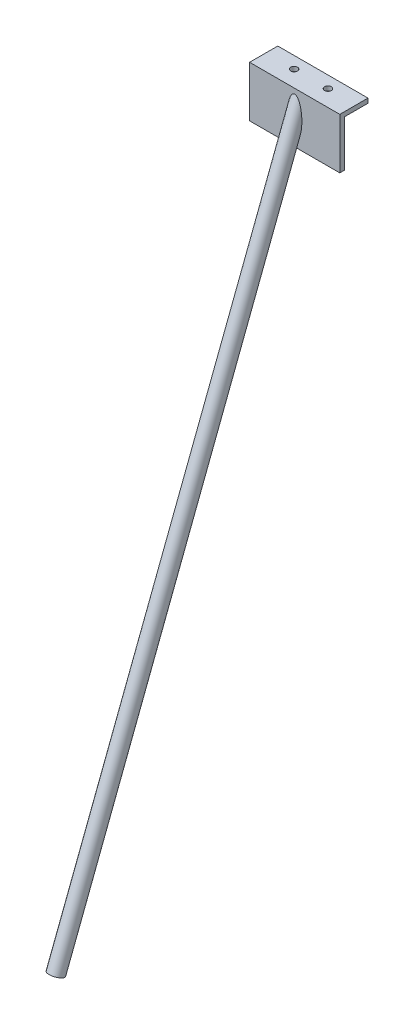
ISO-10303-21;
HEADER;
FILE_DESCRIPTION(('STEP AP214'),'2;1');
FILE_NAME('part.step','',(''),(''),'','','');
FILE_SCHEMA(('AUTOMOTIVE_DESIGN { 1 0 10303 214 1 1 1 1 }'));
ENDSEC;
DATA;
#1=APPLICATION_CONTEXT('core data for automotive mechanical design processes');
#2=APPLICATION_PROTOCOL_DEFINITION('international standard','automotive_design',2000,#1);
#3=PRODUCT_CONTEXT('',#1,'mechanical');
#4=PRODUCT('Part','Part','',(#3));
#5=PRODUCT_RELATED_PRODUCT_CATEGORY('part','',(#4));
#6=PRODUCT_DEFINITION_FORMATION('','',#4);
#7=PRODUCT_DEFINITION_CONTEXT('part definition',#1,'design');
#8=PRODUCT_DEFINITION('design','',#6,#7);
#9=PRODUCT_DEFINITION_SHAPE('','',#8);
#10=(LENGTH_UNIT() NAMED_UNIT(*) SI_UNIT(.MILLI.,.METRE.));
#11=(NAMED_UNIT(*) PLANE_ANGLE_UNIT() SI_UNIT($,.RADIAN.));
#12=(NAMED_UNIT(*) SI_UNIT($,.STERADIAN.) SOLID_ANGLE_UNIT());
#13=UNCERTAINTY_MEASURE_WITH_UNIT(LENGTH_MEASURE(1.E-05),#10,'distance_accuracy_value','');
#14=(GEOMETRIC_REPRESENTATION_CONTEXT(3) GLOBAL_UNCERTAINTY_ASSIGNED_CONTEXT((#13)) GLOBAL_UNIT_ASSIGNED_CONTEXT((#10,
#11,#12)) REPRESENTATION_CONTEXT('',''));
#15=CARTESIAN_POINT('',(0.,0.,0.));
#16=DIRECTION('',(0.,0.,1.));
#17=DIRECTION('',(1.,0.,0.));
#18=AXIS2_PLACEMENT_3D('',#15,#16,#17);
#19=CARTESIAN_POINT('',(80.,0.,0.));
#20=DIRECTION('',(0.,-1.,0.));
#21=DIRECTION('',(0.,0.,-1.));
#22=AXIS2_PLACEMENT_3D('',#19,#20,#21);
#23=PLANE('',#22);
#24=CARTESIAN_POINT('',(25.,0.,-14.5));
#25=DIRECTION('',(0.,1.,0.));
#26=DIRECTION('',(0.,0.,1.));
#27=AXIS2_PLACEMENT_3D('',#24,#25,#26);
#28=CIRCLE('',#27,3.);
#29=CARTESIAN_POINT('',(25.,0.,-11.5));
#30=VERTEX_POINT('',#29);
#31=EDGE_CURVE('E167',#30,#30,#28,.T.);
#32=ORIENTED_EDGE('',*,*,#31,.F.);
#33=EDGE_LOOP('',(#32));
#34=FACE_BOUND('',#33,.T.);
#35=DIRECTION('',(0.,0.,1.));
#36=VECTOR('',#35,1.);
#37=CARTESIAN_POINT('',(0.,0.,0.));
#38=LINE('',#37,#36);
#39=CARTESIAN_POINT('',(0.,0.,-25.));
#40=VERTEX_POINT('',#39);
#41=CARTESIAN_POINT('',(0.,0.,0.));
#42=VERTEX_POINT('',#41);
#43=EDGE_CURVE('E82',#40,#42,#38,.T.);
#44=ORIENTED_EDGE('',*,*,#43,.T.);
#45=DIRECTION('',(-1.,0.,0.));
#46=VECTOR('',#45,1.);
#47=CARTESIAN_POINT('',(80.,0.,0.));
#48=LINE('',#47,#46);
#49=CARTESIAN_POINT('',(80.,0.,0.));
#50=VERTEX_POINT('',#49);
#51=EDGE_CURVE('E118',#50,#42,#48,.T.);
#52=ORIENTED_EDGE('',*,*,#51,.F.);
#53=DIRECTION('',(0.,0.,1.));
#54=VECTOR('',#53,1.);
#55=CARTESIAN_POINT('',(80.,0.,0.));
#56=LINE('',#55,#54);
#57=CARTESIAN_POINT('',(80.,0.,-25.));
#58=VERTEX_POINT('',#57);
#59=EDGE_CURVE('E53',#58,#50,#56,.T.);
#60=ORIENTED_EDGE('',*,*,#59,.F.);
#61=DIRECTION('',(-1.,0.,0.));
#62=VECTOR('',#61,1.);
#63=CARTESIAN_POINT('',(80.,0.,-25.));
#64=LINE('',#63,#62);
#65=EDGE_CURVE('E114',#58,#40,#64,.T.);
#66=ORIENTED_EDGE('',*,*,#65,.T.);
#67=EDGE_LOOP('',(#44,#52,#60,#66));
#68=FACE_BOUND('',#67,.T.);
#69=CARTESIAN_POINT('',(55.,0.,-14.5));
#70=DIRECTION('',(0.,1.,0.));
#71=DIRECTION('',(0.,0.,1.));
#72=AXIS2_PLACEMENT_3D('',#69,#70,#71);
#73=CIRCLE('',#72,3.);
#74=CARTESIAN_POINT('',(55.,0.,-11.5));
#75=VERTEX_POINT('',#74);
#76=EDGE_CURVE('E164',#75,#75,#73,.T.);
#77=ORIENTED_EDGE('',*,*,#76,.F.);
#78=EDGE_LOOP('',(#77));
#79=FACE_BOUND('',#78,.T.);
#80=ADVANCED_FACE('F35',(#34,#68,#79),#23,.F.);
#81=CARTESIAN_POINT('',(80.,-45.,0.));
#82=DIRECTION('',(0.,0.,-1.));
#83=DIRECTION('',(-1.,0.,0.));
#84=AXIS2_PLACEMENT_3D('',#81,#82,#83);
#85=PLANE('',#84);
#86=CARTESIAN_POINT('',(40.,-22.3234248770024,0.));
#87=DIRECTION('',(0.,0.,-1.));
#88=DIRECTION('',(0.,-1.,0.));
#89=AXIS2_PLACEMENT_3D('',#86,#87,#88);
#90=ELLIPSE('',#89,17.7889791988613,6.375);
#91=CARTESIAN_POINT('',(40.,-40.1124040758638,0.));
#92=VERTEX_POINT('',#91);
#93=EDGE_CURVE('E158',#92,#92,#90,.T.);
#94=ORIENTED_EDGE('',*,*,#93,.T.);
#95=EDGE_LOOP('',(#94));
#96=FACE_BOUND('',#95,.T.);
#97=DIRECTION('',(0.,-1.,0.));
#98=VECTOR('',#97,1.);
#99=CARTESIAN_POINT('',(0.,-45.,0.));
#100=LINE('',#99,#98);
#101=CARTESIAN_POINT('',(0.,-45.,0.));
#102=VERTEX_POINT('',#101);
#103=EDGE_CURVE('E122',#42,#102,#100,.T.);
#104=ORIENTED_EDGE('',*,*,#103,.T.);
#105=DIRECTION('',(-1.,0.,0.));
#106=VECTOR('',#105,1.);
#107=CARTESIAN_POINT('',(80.,-45.,0.));
#108=LINE('',#107,#106);
#109=CARTESIAN_POINT('',(80.,-45.,0.));
#110=VERTEX_POINT('',#109);
#111=EDGE_CURVE('E45',#110,#102,#108,.T.);
#112=ORIENTED_EDGE('',*,*,#111,.F.);
#113=DIRECTION('',(0.,-1.,0.));
#114=VECTOR('',#113,1.);
#115=CARTESIAN_POINT('',(80.,-45.,0.));
#116=LINE('',#115,#114);
#117=EDGE_CURVE('E133',#50,#110,#116,.T.);
#118=ORIENTED_EDGE('',*,*,#117,.F.);
#119=ORIENTED_EDGE('',*,*,#51,.T.);
#120=EDGE_LOOP('',(#104,#112,#118,#119));
#121=FACE_BOUND('',#120,.T.);
#122=ADVANCED_FACE('F37',(#96,#121),#85,.F.);
#123=CARTESIAN_POINT('',(80.,-45.,-4.));
#124=DIRECTION('',(0.,1.,0.));
#125=DIRECTION('',(0.,0.,1.));
#126=AXIS2_PLACEMENT_3D('',#123,#124,#125);
#127=PLANE('',#126);
#128=DIRECTION('',(0.,0.,-1.));
#129=VECTOR('',#128,1.);
#130=CARTESIAN_POINT('',(0.,-45.,-4.));
#131=LINE('',#130,#129);
#132=CARTESIAN_POINT('',(0.,-45.,-4.));
#133=VERTEX_POINT('',#132);
#134=EDGE_CURVE('E125',#102,#133,#131,.T.);
#135=ORIENTED_EDGE('',*,*,#134,.T.);
#136=DIRECTION('',(-1.,0.,0.));
#137=VECTOR('',#136,1.);
#138=CARTESIAN_POINT('',(80.,-45.,-4.));
#139=LINE('',#138,#137);
#140=CARTESIAN_POINT('',(80.,-45.,-4.));
#141=VERTEX_POINT('',#140);
#142=EDGE_CURVE('E137',#141,#133,#139,.T.);
#143=ORIENTED_EDGE('',*,*,#142,.F.);
#144=DIRECTION('',(0.,0.,-1.));
#145=VECTOR('',#144,1.);
#146=CARTESIAN_POINT('',(80.,-45.,-4.));
#147=LINE('',#146,#145);
#148=EDGE_CURVE('E91',#110,#141,#147,.T.);
#149=ORIENTED_EDGE('',*,*,#148,.F.);
#150=ORIENTED_EDGE('',*,*,#111,.T.);
#151=EDGE_LOOP('',(#135,#143,#149,#150));
#152=FACE_BOUND('',#151,.T.);
#153=ADVANCED_FACE('F141',(#152),#127,.F.);
#154=CARTESIAN_POINT('',(80.,-4.,-4.));
#155=DIRECTION('',(0.,0.,1.));
#156=DIRECTION('',(0.,-1.,0.));
#157=AXIS2_PLACEMENT_3D('',#154,#155,#156);
#158=PLANE('',#157);
#159=DIRECTION('',(0.,1.,0.));
#160=VECTOR('',#159,1.);
#161=CARTESIAN_POINT('',(0.,-4.,-4.));
#162=LINE('',#161,#160);
#163=CARTESIAN_POINT('',(0.,-4.,-4.));
#164=VERTEX_POINT('',#163);
#165=EDGE_CURVE('E128',#133,#164,#162,.T.);
#166=ORIENTED_EDGE('',*,*,#165,.T.);
#167=DIRECTION('',(-1.,0.,0.));
#168=VECTOR('',#167,1.);
#169=CARTESIAN_POINT('',(80.,-4.,-4.));
#170=LINE('',#169,#168);
#171=CARTESIAN_POINT('',(80.,-4.,-4.));
#172=VERTEX_POINT('',#171);
#173=EDGE_CURVE('E113',#172,#164,#170,.T.);
#174=ORIENTED_EDGE('',*,*,#173,.F.);
#175=DIRECTION('',(0.,1.,0.));
#176=VECTOR('',#175,1.);
#177=CARTESIAN_POINT('',(80.,-4.,-4.));
#178=LINE('',#177,#176);
#179=EDGE_CURVE('E104',#141,#172,#178,.T.);
#180=ORIENTED_EDGE('',*,*,#179,.F.);
#181=ORIENTED_EDGE('',*,*,#142,.T.);
#182=EDGE_LOOP('',(#166,#174,#180,#181));
#183=FACE_BOUND('',#182,.T.);
#184=ADVANCED_FACE('F149',(#183),#158,.F.);
#185=CARTESIAN_POINT('',(80.,-4.,-25.));
#186=DIRECTION('',(0.,1.,0.));
#187=DIRECTION('',(0.,0.,1.));
#188=AXIS2_PLACEMENT_3D('',#185,#186,#187);
#189=PLANE('',#188);
#190=CARTESIAN_POINT('',(25.,-4.,-14.5));
#191=DIRECTION('',(0.,1.,0.));
#192=DIRECTION('',(0.,0.,1.));
#193=AXIS2_PLACEMENT_3D('',#190,#191,#192);
#194=CIRCLE('',#193,2.99999999999993);
#195=CARTESIAN_POINT('',(25.,-4.,-11.5000000000001));
#196=VERTEX_POINT('',#195);
#197=EDGE_CURVE('E39',#196,#196,#194,.T.);
#198=ORIENTED_EDGE('',*,*,#197,.T.);
#199=EDGE_LOOP('',(#198));
#200=FACE_BOUND('',#199,.T.);
#201=CARTESIAN_POINT('',(55.,-4.,-14.5));
#202=DIRECTION('',(0.,1.,0.));
#203=DIRECTION('',(0.,0.,1.));
#204=AXIS2_PLACEMENT_3D('',#201,#202,#203);
#205=CIRCLE('',#204,2.99999999999993);
#206=CARTESIAN_POINT('',(55.,-4.,-11.5000000000001));
#207=VERTEX_POINT('',#206);
#208=EDGE_CURVE('E161',#207,#207,#205,.T.);
#209=ORIENTED_EDGE('',*,*,#208,.T.);
#210=EDGE_LOOP('',(#209));
#211=FACE_BOUND('',#210,.T.);
#212=DIRECTION('',(0.,0.,-1.));
#213=VECTOR('',#212,1.);
#214=CARTESIAN_POINT('',(0.,-4.,-25.));
#215=LINE('',#214,#213);
#216=CARTESIAN_POINT('',(0.,-4.,-25.));
#217=VERTEX_POINT('',#216);
#218=EDGE_CURVE('E112',#164,#217,#215,.T.);
#219=ORIENTED_EDGE('',*,*,#218,.T.);
#220=DIRECTION('',(-1.,0.,0.));
#221=VECTOR('',#220,1.);
#222=CARTESIAN_POINT('',(80.,-4.,-25.));
#223=LINE('',#222,#221);
#224=CARTESIAN_POINT('',(80.,-4.,-25.));
#225=VERTEX_POINT('',#224);
#226=EDGE_CURVE('E109',#225,#217,#223,.T.);
#227=ORIENTED_EDGE('',*,*,#226,.F.);
#228=DIRECTION('',(0.,0.,-1.));
#229=VECTOR('',#228,1.);
#230=CARTESIAN_POINT('',(80.,-4.,-25.));
#231=LINE('',#230,#229);
#232=EDGE_CURVE('E98',#172,#225,#231,.T.);
#233=ORIENTED_EDGE('',*,*,#232,.F.);
#234=ORIENTED_EDGE('',*,*,#173,.T.);
#235=EDGE_LOOP('',(#219,#227,#233,#234));
#236=FACE_BOUND('',#235,.T.);
#237=ADVANCED_FACE('F110',(#200,#211,#236),#189,.F.);
#238=CARTESIAN_POINT('',(80.,0.,-25.));
#239=DIRECTION('',(0.,0.,1.));
#240=DIRECTION('',(1.,0.,0.));
#241=AXIS2_PLACEMENT_3D('',#238,#239,#240);
#242=PLANE('',#241);
#243=DIRECTION('',(0.,1.,0.));
#244=VECTOR('',#243,1.);
#245=CARTESIAN_POINT('',(0.,0.,-25.));
#246=LINE('',#245,#244);
#247=EDGE_CURVE('E76',#217,#40,#246,.T.);
#248=ORIENTED_EDGE('',*,*,#247,.T.);
#249=ORIENTED_EDGE('',*,*,#65,.F.);
#250=DIRECTION('',(0.,1.,0.));
#251=VECTOR('',#250,1.);
#252=CARTESIAN_POINT('',(80.,0.,-25.));
#253=LINE('',#252,#251);
#254=EDGE_CURVE('E102',#225,#58,#253,.T.);
#255=ORIENTED_EDGE('',*,*,#254,.F.);
#256=ORIENTED_EDGE('',*,*,#226,.T.);
#257=EDGE_LOOP('',(#248,#249,#255,#256));
#258=FACE_BOUND('',#257,.T.);
#259=ADVANCED_FACE('F116',(#258),#242,.F.);
#260=CARTESIAN_POINT('',(80.,0.,0.));
#261=DIRECTION('',(-1.,0.,0.));
#262=DIRECTION('',(0.,0.,1.));
#263=AXIS2_PLACEMENT_3D('',#260,#261,#262);
#264=PLANE('',#263);
#265=ORIENTED_EDGE('',*,*,#117,.T.);
#266=ORIENTED_EDGE('',*,*,#148,.T.);
#267=ORIENTED_EDGE('',*,*,#179,.T.);
#268=ORIENTED_EDGE('',*,*,#232,.T.);
#269=ORIENTED_EDGE('',*,*,#254,.T.);
#270=ORIENTED_EDGE('',*,*,#59,.T.);
#271=EDGE_LOOP('',(#265,#266,#267,#268,#269,#270));
#272=FACE_BOUND('',#271,.T.);
#273=ADVANCED_FACE('F100',(#272),#264,.F.);
#274=CARTESIAN_POINT('',(0.,0.,0.));
#275=DIRECTION('',(-1.,0.,0.));
#276=DIRECTION('',(0.,0.,1.));
#277=AXIS2_PLACEMENT_3D('',#274,#275,#276);
#278=PLANE('',#277);
#279=ORIENTED_EDGE('',*,*,#103,.F.);
#280=ORIENTED_EDGE('',*,*,#43,.F.);
#281=ORIENTED_EDGE('',*,*,#247,.F.);
#282=ORIENTED_EDGE('',*,*,#218,.F.);
#283=ORIENTED_EDGE('',*,*,#165,.F.);
#284=ORIENTED_EDGE('',*,*,#134,.F.);
#285=EDGE_LOOP('',(#279,#280,#281,#282,#283,#284));
#286=FACE_BOUND('',#285,.T.);
#287=ADVANCED_FACE('F146',(#286),#278,.T.);
#288=CARTESIAN_POINT('',(40.,-574.228545273008,211.85652647192));
#289=DIRECTION('',(0.,0.9335804264972,-0.358367949545304));
#290=DIRECTION('',(0.,0.358367949545304,0.9335804264972));
#291=AXIS2_PLACEMENT_3D('',#288,#289,#290);
#292=CYLINDRICAL_SURFACE('',#291,6.375);
#293=CARTESIAN_POINT('',(40.,-574.228545273008,211.85652647192));
#294=DIRECTION('',(0.,0.9335804264972,-0.358367949545304));
#295=DIRECTION('',(0.,0.358367949545304,0.9335804264972));
#296=AXIS2_PLACEMENT_3D('',#293,#294,#295);
#297=CIRCLE('',#296,6.375);
#298=CARTESIAN_POINT('',(40.,-571.943949594656,217.80810169084));
#299=VERTEX_POINT('',#298);
#300=EDGE_CURVE('E126',#299,#299,#297,.T.);
#301=ORIENTED_EDGE('',*,*,#300,.T.);
#302=EDGE_LOOP('',(#301));
#303=FACE_BOUND('',#302,.T.);
#304=ORIENTED_EDGE('',*,*,#93,.F.);
#305=EDGE_LOOP('',(#304));
#306=FACE_BOUND('',#305,.T.);
#307=ADVANCED_FACE('F230',(#303,#306),#292,.T.);
#308=CARTESIAN_POINT('',(40.,-574.228545273008,211.85652647192));
#309=DIRECTION('',(0.,0.9335804264972,-0.358367949545304));
#310=DIRECTION('',(0.,0.358367949545304,0.9335804264972));
#311=AXIS2_PLACEMENT_3D('',#308,#309,#310);
#312=PLANE('',#311);
#313=CARTESIAN_POINT('',(40.,-574.228545273008,211.85652647192));
#314=DIRECTION('',(0.,0.9335804264972,-0.358367949545304));
#315=DIRECTION('',(0.,0.358367949545304,0.9335804264972));
#316=AXIS2_PLACEMENT_3D('',#313,#314,#315);
#317=CIRCLE('',#316,4.9);
#318=CARTESIAN_POINT('',(40.,-572.472542320236,216.431070561757));
#319=VERTEX_POINT('',#318);
#320=EDGE_CURVE('E155',#319,#319,#317,.T.);
#321=ORIENTED_EDGE('',*,*,#320,.T.);
#322=EDGE_LOOP('',(#321));
#323=FACE_BOUND('',#322,.T.);
#324=ORIENTED_EDGE('',*,*,#300,.F.);
#325=EDGE_LOOP('',(#324));
#326=FACE_BOUND('',#325,.T.);
#327=ADVANCED_FACE('F236',(#323,#326),#312,.F.);
#328=CARTESIAN_POINT('',(40.,-574.228545273008,211.85652647192));
#329=DIRECTION('',(0.,0.9335804264972,-0.358367949545304));
#330=DIRECTION('',(0.,0.358367949545304,0.9335804264972));
#331=AXIS2_PLACEMENT_3D('',#328,#329,#330);
#332=CYLINDRICAL_SURFACE('',#331,4.9);
#333=ORIENTED_EDGE('',*,*,#320,.F.);
#334=EDGE_LOOP('',(#333));
#335=FACE_BOUND('',#334,.T.);
#336=CARTESIAN_POINT('',(40.,-22.3234248770025,0.));
#337=DIRECTION('',(0.,0.,-1.));
#338=DIRECTION('',(0.,1.,0.));
#339=AXIS2_PLACEMENT_3D('',#336,#337,#338);
#340=ELLIPSE('',#339,13.673097737164,4.9);
#341=CARTESIAN_POINT('',(40.,-8.65032713983845,0.));
#342=VERTEX_POINT('',#341);
#343=EDGE_CURVE('E11',#342,#342,#340,.T.);
#344=ORIENTED_EDGE('',*,*,#343,.T.);
#345=EDGE_LOOP('',(#344));
#346=FACE_BOUND('',#345,.T.);
#347=ADVANCED_FACE('F244',(#335,#346),#332,.F.);
#348=ORIENTED_EDGE('',*,*,#343,.F.);
#349=EDGE_LOOP('',(#348));
#350=FACE_BOUND('',#349,.T.);
#351=ADVANCED_FACE('F183',(#350),#85,.F.);
#352=CARTESIAN_POINT('',(55.,0.,-14.5));
#353=DIRECTION('',(0.,1.,0.));
#354=DIRECTION('',(0.,0.,1.));
#355=AXIS2_PLACEMENT_3D('',#352,#353,#354);
#356=CYLINDRICAL_SURFACE('',#355,2.99999999999993);
#357=ORIENTED_EDGE('',*,*,#76,.T.);
#358=EDGE_LOOP('',(#357));
#359=FACE_BOUND('',#358,.T.);
#360=ORIENTED_EDGE('',*,*,#208,.F.);
#361=EDGE_LOOP('',(#360));
#362=FACE_BOUND('',#361,.T.);
#363=ADVANCED_FACE('F178',(#359,#362),#356,.F.);
#364=CARTESIAN_POINT('',(25.,0.,-14.5));
#365=DIRECTION('',(0.,1.,0.));
#366=DIRECTION('',(0.,0.,1.));
#367=AXIS2_PLACEMENT_3D('',#364,#365,#366);
#368=CYLINDRICAL_SURFACE('',#367,2.99999999999993);
#369=ORIENTED_EDGE('',*,*,#31,.T.);
#370=EDGE_LOOP('',(#369));
#371=FACE_BOUND('',#370,.T.);
#372=ORIENTED_EDGE('',*,*,#197,.F.);
#373=EDGE_LOOP('',(#372));
#374=FACE_BOUND('',#373,.T.);
#375=ADVANCED_FACE('F176',(#371,#374),#368,.F.);
#376=CLOSED_SHELL('',(#80,#122,#153,#184,#237,#259,#273,#287,#307,#327,#347,#351,#363,#375));
#377=MANIFOLD_SOLID_BREP('B2',#376);
#378=ADVANCED_BREP_SHAPE_REPRESENTATION('',(#18,#377),#14);
#379=SHAPE_DEFINITION_REPRESENTATION(#9,#378);
ENDSEC;
END-ISO-10303-21;
